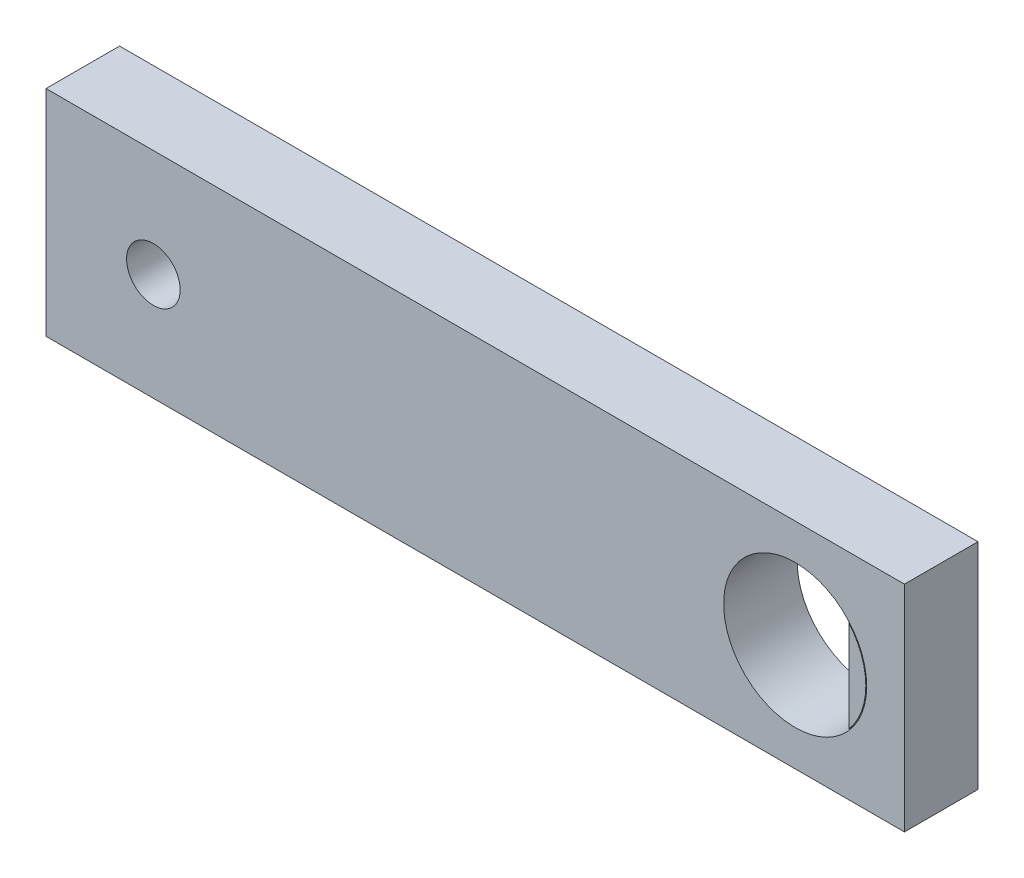
ISO-10303-21;
HEADER;
FILE_DESCRIPTION(('STEP AP214'),'2;1');
FILE_NAME('part.step','',(''),(''),'','','');
FILE_SCHEMA(('AUTOMOTIVE_DESIGN { 1 0 10303 214 1 1 1 1 }'));
ENDSEC;
DATA;
#1=APPLICATION_CONTEXT('core data for automotive mechanical design processes');
#2=APPLICATION_PROTOCOL_DEFINITION('international standard','automotive_design',2000,#1);
#3=PRODUCT_CONTEXT('',#1,'mechanical');
#4=PRODUCT('Part','Part','',(#3));
#5=PRODUCT_RELATED_PRODUCT_CATEGORY('part','',(#4));
#6=PRODUCT_DEFINITION_FORMATION('','',#4);
#7=PRODUCT_DEFINITION_CONTEXT('part definition',#1,'design');
#8=PRODUCT_DEFINITION('design','',#6,#7);
#9=PRODUCT_DEFINITION_SHAPE('','',#8);
#10=(LENGTH_UNIT() NAMED_UNIT(*) SI_UNIT(.MILLI.,.METRE.));
#11=(NAMED_UNIT(*) PLANE_ANGLE_UNIT() SI_UNIT($,.RADIAN.));
#12=(NAMED_UNIT(*) SI_UNIT($,.STERADIAN.) SOLID_ANGLE_UNIT());
#13=UNCERTAINTY_MEASURE_WITH_UNIT(LENGTH_MEASURE(1.E-05),#10,'distance_accuracy_value','');
#14=(GEOMETRIC_REPRESENTATION_CONTEXT(3) GLOBAL_UNCERTAINTY_ASSIGNED_CONTEXT((#13)) GLOBAL_UNIT_ASSIGNED_CONTEXT((#10,
#11,#12)) REPRESENTATION_CONTEXT('',''));
#15=CARTESIAN_POINT('',(0.,0.,0.));
#16=DIRECTION('',(0.,0.,1.));
#17=DIRECTION('',(1.,0.,0.));
#18=AXIS2_PLACEMENT_3D('',#15,#16,#17);
#19=CARTESIAN_POINT('',(33.16,0.,0.18));
#20=DIRECTION('',(-1.,0.,0.));
#21=DIRECTION('',(0.,0.,1.));
#22=AXIS2_PLACEMENT_3D('',#19,#20,#21);
#23=PLANE('',#22);
#24=DIRECTION('',(0.,-1.,0.));
#25=VECTOR('',#24,1.);
#26=CARTESIAN_POINT('',(33.16,0.,6.53));
#27=LINE('',#26,#25);
#28=CARTESIAN_POINT('',(33.16,4.08392527025021,6.53));
#29=VERTEX_POINT('',#28);
#30=CARTESIAN_POINT('',(33.16,-4.08392527025021,6.53));
#31=VERTEX_POINT('',#30);
#32=EDGE_CURVE('E80',#29,#31,#27,.T.);
#33=ORIENTED_EDGE('',*,*,#32,.F.);
#34=DIRECTION('',(0.,0.,1.));
#35=VECTOR('',#34,1.);
#36=CARTESIAN_POINT('',(33.16,4.08392527025021,0.18));
#37=LINE('',#36,#35);
#38=CARTESIAN_POINT('',(33.16,4.08392527025021,0.18));
#39=VERTEX_POINT('',#38);
#40=EDGE_CURVE('E12',#39,#29,#37,.T.);
#41=ORIENTED_EDGE('',*,*,#40,.F.);
#42=DIRECTION('',(0.,-1.,0.));
#43=VECTOR('',#42,1.);
#44=CARTESIAN_POINT('',(33.16,0.,0.18));
#45=LINE('',#44,#43);
#46=CARTESIAN_POINT('',(33.16,-4.08392527025021,0.18));
#47=VERTEX_POINT('',#46);
#48=EDGE_CURVE('E84',#39,#47,#45,.T.);
#49=ORIENTED_EDGE('',*,*,#48,.T.);
#50=DIRECTION('',(0.,0.,1.));
#51=VECTOR('',#50,1.);
#52=CARTESIAN_POINT('',(33.16,-4.08392527025021,0.18));
#53=LINE('',#52,#51);
#54=EDGE_CURVE('E54',#47,#31,#53,.T.);
#55=ORIENTED_EDGE('',*,*,#54,.T.);
#56=EDGE_LOOP('',(#33,#41,#49,#55));
#57=FACE_BOUND('',#56,.T.);
#58=ADVANCED_FACE('F51',(#57),#23,.T.);
#59=CARTESIAN_POINT('',(28.4,0.,0.18));
#60=DIRECTION('',(0.,0.,1.));
#61=DIRECTION('',(1.,0.,0.));
#62=AXIS2_PLACEMENT_3D('',#59,#60,#61);
#63=CYLINDRICAL_SURFACE('',#62,6.27184547107056);
#64=CARTESIAN_POINT('',(28.4,0.,6.53));
#65=DIRECTION('',(0.,0.,1.));
#66=DIRECTION('',(1.,0.,0.));
#67=AXIS2_PLACEMENT_3D('',#64,#65,#66);
#68=CIRCLE('',#67,6.27184547107056);
#69=EDGE_CURVE('E77',#31,#29,#68,.T.);
#70=ORIENTED_EDGE('',*,*,#69,.F.);
#71=ORIENTED_EDGE('',*,*,#54,.F.);
#72=CARTESIAN_POINT('',(28.4,0.,0.18));
#73=DIRECTION('',(0.,0.,1.));
#74=DIRECTION('',(1.,0.,0.));
#75=AXIS2_PLACEMENT_3D('',#72,#73,#74);
#76=CIRCLE('',#75,6.27184547107056);
#77=EDGE_CURVE('E79',#47,#39,#76,.T.);
#78=ORIENTED_EDGE('',*,*,#77,.T.);
#79=ORIENTED_EDGE('',*,*,#40,.T.);
#80=EDGE_LOOP('',(#70,#71,#78,#79));
#81=FACE_BOUND('',#80,.T.);
#82=ADVANCED_FACE('F75',(#81),#63,.T.);
#83=CARTESIAN_POINT('',(0.,0.,0.18));
#84=DIRECTION('',(0.,0.,1.));
#85=DIRECTION('',(1.,0.,0.));
#86=AXIS2_PLACEMENT_3D('',#83,#84,#85);
#87=PLANE('',#86);
#88=ORIENTED_EDGE('',*,*,#48,.F.);
#89=ORIENTED_EDGE('',*,*,#77,.F.);
#90=EDGE_LOOP('',(#88,#89));
#91=FACE_BOUND('',#90,.T.);
#92=ADVANCED_FACE('F89',(#91),#87,.F.);
#93=CARTESIAN_POINT('',(0.,0.,6.53));
#94=DIRECTION('',(0.,0.,1.));
#95=DIRECTION('',(1.,0.,0.));
#96=AXIS2_PLACEMENT_3D('',#93,#94,#95);
#97=PLANE('',#96);
#98=ORIENTED_EDGE('',*,*,#32,.T.);
#99=ORIENTED_EDGE('',*,*,#69,.T.);
#100=EDGE_LOOP('',(#98,#99));
#101=FACE_BOUND('',#100,.T.);
#102=ADVANCED_FACE('F83',(#101),#97,.T.);
#103=CLOSED_SHELL('',(#58,#82,#92,#102));
#104=MANIFOLD_SOLID_BREP('B2',#103);
#105=CARTESIAN_POINT('',(0.,0.,6.53));
#106=DIRECTION('',(0.,0.,-1.));
#107=DIRECTION('',(-1.,0.,0.));
#108=AXIS2_PLACEMENT_3D('',#105,#106,#107);
#109=PLANE('',#108);
#110=DIRECTION('',(0.,1.,0.));
#111=VECTOR('',#110,1.);
#112=CARTESIAN_POINT('',(38.1,-9.525,6.53));
#113=LINE('',#112,#111);
#114=CARTESIAN_POINT('',(38.1,-9.525,6.53));
#115=VERTEX_POINT('',#114);
#116=CARTESIAN_POINT('',(38.1,9.525,6.53));
#117=VERTEX_POINT('',#116);
#118=EDGE_CURVE('E175',#115,#117,#113,.T.);
#119=ORIENTED_EDGE('',*,*,#118,.T.);
#120=DIRECTION('',(-1.,0.,0.));
#121=VECTOR('',#120,1.);
#122=CARTESIAN_POINT('',(-38.1,9.525,6.53));
#123=LINE('',#122,#121);
#124=CARTESIAN_POINT('',(-38.1,9.525,6.53));
#125=VERTEX_POINT('',#124);
#126=EDGE_CURVE('E170',#117,#125,#123,.T.);
#127=ORIENTED_EDGE('',*,*,#126,.T.);
#128=DIRECTION('',(0.,-1.,0.));
#129=VECTOR('',#128,1.);
#130=CARTESIAN_POINT('',(-38.1,-9.525,6.53));
#131=LINE('',#130,#129);
#132=CARTESIAN_POINT('',(-38.1,-9.525,6.53));
#133=VERTEX_POINT('',#132);
#134=EDGE_CURVE('E173',#125,#133,#131,.T.);
#135=ORIENTED_EDGE('',*,*,#134,.T.);
#136=DIRECTION('',(1.,0.,0.));
#137=VECTOR('',#136,1.);
#138=CARTESIAN_POINT('',(-38.1,-9.525,6.53));
#139=LINE('',#138,#137);
#140=EDGE_CURVE('E140',#133,#115,#139,.T.);
#141=ORIENTED_EDGE('',*,*,#140,.T.);
#142=EDGE_LOOP('',(#119,#127,#135,#141));
#143=FACE_BOUND('',#142,.T.);
#144=CARTESIAN_POINT('',(-28.57,0.,6.53));
#145=DIRECTION('',(0.,0.,1.));
#146=DIRECTION('',(1.,0.,0.));
#147=AXIS2_PLACEMENT_3D('',#144,#145,#146);
#148=CIRCLE('',#147,2.38);
#149=CARTESIAN_POINT('',(-26.19,0.,6.53));
#150=VERTEX_POINT('',#149);
#151=EDGE_CURVE('E195',#150,#150,#148,.T.);
#152=ORIENTED_EDGE('',*,*,#151,.F.);
#153=EDGE_LOOP('',(#152));
#154=FACE_BOUND('',#153,.T.);
#155=CARTESIAN_POINT('',(28.4,0.,6.53));
#156=DIRECTION('',(0.,0.,1.));
#157=DIRECTION('',(1.,0.,0.));
#158=AXIS2_PLACEMENT_3D('',#155,#156,#157);
#159=CIRCLE('',#158,6.35);
#160=CARTESIAN_POINT('',(34.75,0.,6.53));
#161=VERTEX_POINT('',#160);
#162=EDGE_CURVE('E217',#161,#161,#159,.T.);
#163=ORIENTED_EDGE('',*,*,#162,.F.);
#164=EDGE_LOOP('',(#163));
#165=FACE_BOUND('',#164,.T.);
#166=ADVANCED_FACE('F122',(#143,#154,#165),#109,.F.);
#167=CARTESIAN_POINT('',(0.,0.,0.));
#168=DIRECTION('',(0.,0.,-1.));
#169=DIRECTION('',(-1.,0.,0.));
#170=AXIS2_PLACEMENT_3D('',#167,#168,#169);
#171=PLANE('',#170);
#172=CARTESIAN_POINT('',(-28.57,0.,0.));
#173=DIRECTION('',(0.,0.,1.));
#174=DIRECTION('',(1.,0.,0.));
#175=AXIS2_PLACEMENT_3D('',#172,#173,#174);
#176=CIRCLE('',#175,2.38);
#177=CARTESIAN_POINT('',(-26.19,0.,0.));
#178=VERTEX_POINT('',#177);
#179=EDGE_CURVE('E213',#178,#178,#176,.T.);
#180=ORIENTED_EDGE('',*,*,#179,.T.);
#181=EDGE_LOOP('',(#180));
#182=FACE_BOUND('',#181,.T.);
#183=DIRECTION('',(0.,1.,0.));
#184=VECTOR('',#183,1.);
#185=CARTESIAN_POINT('',(38.1,-9.525,0.));
#186=LINE('',#185,#184);
#187=CARTESIAN_POINT('',(38.1,-9.525,0.));
#188=VERTEX_POINT('',#187);
#189=CARTESIAN_POINT('',(38.1,9.525,0.));
#190=VERTEX_POINT('',#189);
#191=EDGE_CURVE('E191',#188,#190,#186,.T.);
#192=ORIENTED_EDGE('',*,*,#191,.F.);
#193=DIRECTION('',(1.,0.,0.));
#194=VECTOR('',#193,1.);
#195=CARTESIAN_POINT('',(-38.1,-9.525,0.));
#196=LINE('',#195,#194);
#197=CARTESIAN_POINT('',(-38.1,-9.525,0.));
#198=VERTEX_POINT('',#197);
#199=EDGE_CURVE('E163',#198,#188,#196,.T.);
#200=ORIENTED_EDGE('',*,*,#199,.F.);
#201=DIRECTION('',(0.,-1.,0.));
#202=VECTOR('',#201,1.);
#203=CARTESIAN_POINT('',(-38.1,-9.525,0.));
#204=LINE('',#203,#202);
#205=CARTESIAN_POINT('',(-38.1,9.525,0.));
#206=VERTEX_POINT('',#205);
#207=EDGE_CURVE('E157',#206,#198,#204,.T.);
#208=ORIENTED_EDGE('',*,*,#207,.F.);
#209=DIRECTION('',(-1.,0.,0.));
#210=VECTOR('',#209,1.);
#211=CARTESIAN_POINT('',(-38.1,9.525,0.));
#212=LINE('',#211,#210);
#213=EDGE_CURVE('E180',#190,#206,#212,.T.);
#214=ORIENTED_EDGE('',*,*,#213,.F.);
#215=EDGE_LOOP('',(#192,#200,#208,#214));
#216=FACE_BOUND('',#215,.T.);
#217=CARTESIAN_POINT('',(28.4,0.,0.));
#218=DIRECTION('',(0.,0.,1.));
#219=DIRECTION('',(1.,0.,0.));
#220=AXIS2_PLACEMENT_3D('',#217,#218,#219);
#221=CIRCLE('',#220,6.35);
#222=CARTESIAN_POINT('',(34.75,0.,0.));
#223=VERTEX_POINT('',#222);
#224=EDGE_CURVE('E221',#223,#223,#221,.T.);
#225=ORIENTED_EDGE('',*,*,#224,.T.);
#226=EDGE_LOOP('',(#225));
#227=FACE_BOUND('',#226,.T.);
#228=ADVANCED_FACE('F208',(#182,#216,#227),#171,.T.);
#229=CARTESIAN_POINT('',(38.1,-9.525,6.53));
#230=DIRECTION('',(-1.,0.,0.));
#231=DIRECTION('',(0.,0.,1.));
#232=AXIS2_PLACEMENT_3D('',#229,#230,#231);
#233=PLANE('',#232);
#234=ORIENTED_EDGE('',*,*,#191,.T.);
#235=DIRECTION('',(0.,0.,-1.));
#236=VECTOR('',#235,1.);
#237=CARTESIAN_POINT('',(38.1,9.525,6.53));
#238=LINE('',#237,#236);
#239=EDGE_CURVE('E49',#117,#190,#238,.T.);
#240=ORIENTED_EDGE('',*,*,#239,.F.);
#241=ORIENTED_EDGE('',*,*,#118,.F.);
#242=DIRECTION('',(0.,0.,-1.));
#243=VECTOR('',#242,1.);
#244=CARTESIAN_POINT('',(38.1,-9.525,6.53));
#245=LINE('',#244,#243);
#246=EDGE_CURVE('E187',#115,#188,#245,.T.);
#247=ORIENTED_EDGE('',*,*,#246,.T.);
#248=EDGE_LOOP('',(#234,#240,#241,#247));
#249=FACE_BOUND('',#248,.T.);
#250=ADVANCED_FACE('F124',(#249),#233,.F.);
#251=CARTESIAN_POINT('',(-38.1,9.525,6.53));
#252=DIRECTION('',(0.,-1.,0.));
#253=DIRECTION('',(0.,0.,-1.));
#254=AXIS2_PLACEMENT_3D('',#251,#252,#253);
#255=PLANE('',#254);
#256=ORIENTED_EDGE('',*,*,#213,.T.);
#257=DIRECTION('',(0.,0.,-1.));
#258=VECTOR('',#257,1.);
#259=CARTESIAN_POINT('',(-38.1,9.525,6.53));
#260=LINE('',#259,#258);
#261=EDGE_CURVE('E132',#125,#206,#260,.T.);
#262=ORIENTED_EDGE('',*,*,#261,.F.);
#263=ORIENTED_EDGE('',*,*,#126,.F.);
#264=ORIENTED_EDGE('',*,*,#239,.T.);
#265=EDGE_LOOP('',(#256,#262,#263,#264));
#266=FACE_BOUND('',#265,.T.);
#267=ADVANCED_FACE('F179',(#266),#255,.F.);
#268=CARTESIAN_POINT('',(-38.1,-9.525,6.53));
#269=DIRECTION('',(1.,0.,0.));
#270=DIRECTION('',(0.,0.,-1.));
#271=AXIS2_PLACEMENT_3D('',#268,#269,#270);
#272=PLANE('',#271);
#273=ORIENTED_EDGE('',*,*,#207,.T.);
#274=DIRECTION('',(0.,0.,-1.));
#275=VECTOR('',#274,1.);
#276=CARTESIAN_POINT('',(-38.1,-9.525,6.53));
#277=LINE('',#276,#275);
#278=EDGE_CURVE('E182',#133,#198,#277,.T.);
#279=ORIENTED_EDGE('',*,*,#278,.F.);
#280=ORIENTED_EDGE('',*,*,#134,.F.);
#281=ORIENTED_EDGE('',*,*,#261,.T.);
#282=EDGE_LOOP('',(#273,#279,#280,#281));
#283=FACE_BOUND('',#282,.T.);
#284=ADVANCED_FACE('F183',(#283),#272,.F.);
#285=CARTESIAN_POINT('',(-38.1,-9.525,6.53));
#286=DIRECTION('',(0.,1.,0.));
#287=DIRECTION('',(0.,0.,1.));
#288=AXIS2_PLACEMENT_3D('',#285,#286,#287);
#289=PLANE('',#288);
#290=ORIENTED_EDGE('',*,*,#199,.T.);
#291=ORIENTED_EDGE('',*,*,#246,.F.);
#292=ORIENTED_EDGE('',*,*,#140,.F.);
#293=ORIENTED_EDGE('',*,*,#278,.T.);
#294=EDGE_LOOP('',(#290,#291,#292,#293));
#295=FACE_BOUND('',#294,.T.);
#296=ADVANCED_FACE('F205',(#295),#289,.F.);
#297=CARTESIAN_POINT('',(-28.57,0.,6.53));
#298=DIRECTION('',(0.,0.,-1.));
#299=DIRECTION('',(-1.,0.,0.));
#300=AXIS2_PLACEMENT_3D('',#297,#298,#299);
#301=CYLINDRICAL_SURFACE('',#300,2.38);
#302=ORIENTED_EDGE('',*,*,#151,.T.);
#303=EDGE_LOOP('',(#302));
#304=FACE_BOUND('',#303,.T.);
#305=ORIENTED_EDGE('',*,*,#179,.F.);
#306=EDGE_LOOP('',(#305));
#307=FACE_BOUND('',#306,.T.);
#308=ADVANCED_FACE('F240',(#304,#307),#301,.F.);
#309=CARTESIAN_POINT('',(28.4,0.,6.53));
#310=DIRECTION('',(0.,0.,-1.));
#311=DIRECTION('',(-1.,0.,0.));
#312=AXIS2_PLACEMENT_3D('',#309,#310,#311);
#313=CYLINDRICAL_SURFACE('',#312,6.35);
#314=ORIENTED_EDGE('',*,*,#162,.T.);
#315=EDGE_LOOP('',(#314));
#316=FACE_BOUND('',#315,.T.);
#317=ORIENTED_EDGE('',*,*,#224,.F.);
#318=EDGE_LOOP('',(#317));
#319=FACE_BOUND('',#318,.T.);
#320=ADVANCED_FACE('F229',(#316,#319),#313,.F.);
#321=CLOSED_SHELL('',(#166,#228,#250,#267,#284,#296,#308,#320));
#322=MANIFOLD_SOLID_BREP('B6',#321);
#323=ADVANCED_BREP_SHAPE_REPRESENTATION('',(#18,#104,#322),#14);
#324=SHAPE_DEFINITION_REPRESENTATION(#9,#323);
ENDSEC;
END-ISO-10303-21;
